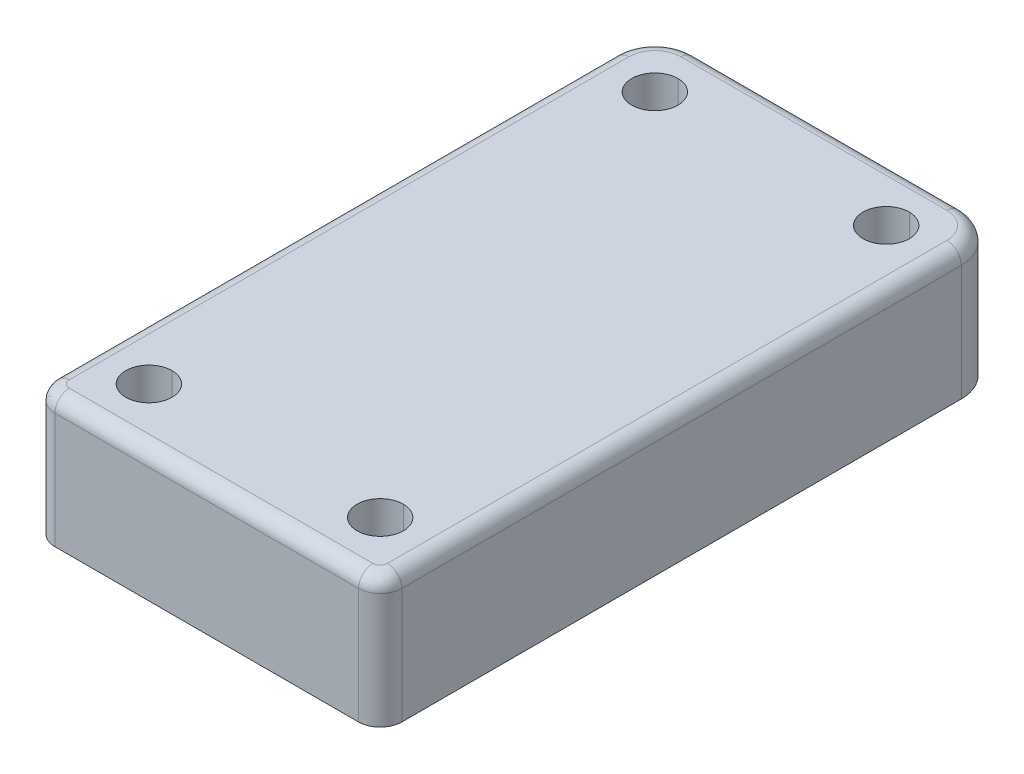
ISO-10303-21;
HEADER;
FILE_DESCRIPTION(('STEP AP214'),'2;1');
FILE_NAME('part.step','',(''),(''),'','','');
FILE_SCHEMA(('AUTOMOTIVE_DESIGN { 1 0 10303 214 1 1 1 1 }'));
ENDSEC;
DATA;
#1=APPLICATION_CONTEXT('core data for automotive mechanical design processes');
#2=APPLICATION_PROTOCOL_DEFINITION('international standard','automotive_design',2000,#1);
#3=PRODUCT_CONTEXT('',#1,'mechanical');
#4=PRODUCT('Part','Part','',(#3));
#5=PRODUCT_RELATED_PRODUCT_CATEGORY('part','',(#4));
#6=PRODUCT_DEFINITION_FORMATION('','',#4);
#7=PRODUCT_DEFINITION_CONTEXT('part definition',#1,'design');
#8=PRODUCT_DEFINITION('design','',#6,#7);
#9=PRODUCT_DEFINITION_SHAPE('','',#8);
#10=(LENGTH_UNIT() NAMED_UNIT(*) SI_UNIT(.MILLI.,.METRE.));
#11=(NAMED_UNIT(*) PLANE_ANGLE_UNIT() SI_UNIT($,.RADIAN.));
#12=(NAMED_UNIT(*) SI_UNIT($,.STERADIAN.) SOLID_ANGLE_UNIT());
#13=UNCERTAINTY_MEASURE_WITH_UNIT(LENGTH_MEASURE(1.E-05),#10,'distance_accuracy_value','');
#14=(GEOMETRIC_REPRESENTATION_CONTEXT(3) GLOBAL_UNCERTAINTY_ASSIGNED_CONTEXT((#13)) GLOBAL_UNIT_ASSIGNED_CONTEXT((#10,
#11,#12)) REPRESENTATION_CONTEXT('',''));
#15=CARTESIAN_POINT('',(0.,0.,0.));
#16=DIRECTION('',(0.,0.,1.));
#17=DIRECTION('',(1.,0.,0.));
#18=AXIS2_PLACEMENT_3D('',#15,#16,#17);
#19=CARTESIAN_POINT('',(-8.,0.,-39.));
#20=DIRECTION('',(0.,-1.,0.));
#21=DIRECTION('',(0.,0.,-1.));
#22=AXIS2_PLACEMENT_3D('',#19,#20,#21);
#23=CYLINDRICAL_SURFACE('',#22,1.6);
#24=DIRECTION('',(0.,1.,0.));
#25=VECTOR('',#24,1.);
#26=CARTESIAN_POINT('',(-8.,38.,-40.6));
#27=LINE('',#26,#25);
#28=CARTESIAN_POINT('',(-8.,38.,-40.6));
#29=VERTEX_POINT('',#28);
#30=CARTESIAN_POINT('',(-8.,47.,-40.6));
#31=VERTEX_POINT('',#30);
#32=EDGE_CURVE('E11',#29,#31,#27,.T.);
#33=ORIENTED_EDGE('',*,*,#32,.T.);
#34=CARTESIAN_POINT('',(-8.,47.,-39.));
#35=DIRECTION('',(0.,-1.,0.));
#36=DIRECTION('',(0.,0.,1.));
#37=AXIS2_PLACEMENT_3D('',#34,#35,#36);
#38=CIRCLE('',#37,1.6);
#39=CARTESIAN_POINT('',(-8.,47.,-37.4));
#40=VERTEX_POINT('',#39);
#41=EDGE_CURVE('E344',#40,#31,#38,.T.);
#42=ORIENTED_EDGE('',*,*,#41,.F.);
#43=DIRECTION('',(0.,1.,0.));
#44=VECTOR('',#43,1.);
#45=CARTESIAN_POINT('',(-8.,38.,-37.4));
#46=LINE('',#45,#44);
#47=CARTESIAN_POINT('',(-8.,38.,-37.4));
#48=VERTEX_POINT('',#47);
#49=EDGE_CURVE('E26',#48,#40,#46,.T.);
#50=ORIENTED_EDGE('',*,*,#49,.F.);
#51=CARTESIAN_POINT('',(-8.,38.,-39.));
#52=DIRECTION('',(0.,-1.,0.));
#53=DIRECTION('',(0.,0.,1.));
#54=AXIS2_PLACEMENT_3D('',#51,#52,#53);
#55=CIRCLE('',#54,1.6);
#56=EDGE_CURVE('E222',#48,#29,#55,.T.);
#57=ORIENTED_EDGE('',*,*,#56,.T.);
#58=EDGE_LOOP('',(#33,#42,#50,#57));
#59=FACE_BOUND('',#58,.T.);
#60=ADVANCED_FACE('F16',(#59),#23,.F.);
#61=CARTESIAN_POINT('',(-8.,0.,-39.));
#62=DIRECTION('',(0.,-1.,0.));
#63=DIRECTION('',(0.,0.,-1.));
#64=AXIS2_PLACEMENT_3D('',#61,#62,#63);
#65=CYLINDRICAL_SURFACE('',#64,1.6);
#66=ORIENTED_EDGE('',*,*,#49,.T.);
#67=CARTESIAN_POINT('',(-8.,47.,-39.));
#68=DIRECTION('',(0.,-1.,0.));
#69=DIRECTION('',(0.,0.,-1.));
#70=AXIS2_PLACEMENT_3D('',#67,#68,#69);
#71=CIRCLE('',#70,1.6);
#72=EDGE_CURVE('E337',#31,#40,#71,.T.);
#73=ORIENTED_EDGE('',*,*,#72,.F.);
#74=ORIENTED_EDGE('',*,*,#32,.F.);
#75=CARTESIAN_POINT('',(-8.,38.,-39.));
#76=DIRECTION('',(0.,-1.,0.));
#77=DIRECTION('',(0.,0.,-1.));
#78=AXIS2_PLACEMENT_3D('',#75,#76,#77);
#79=CIRCLE('',#78,1.6);
#80=EDGE_CURVE('E284',#29,#48,#79,.T.);
#81=ORIENTED_EDGE('',*,*,#80,.T.);
#82=EDGE_LOOP('',(#66,#73,#74,#81));
#83=FACE_BOUND('',#82,.T.);
#84=ADVANCED_FACE('F595',(#83),#65,.F.);
#85=CARTESIAN_POINT('',(-8.,0.,-4.));
#86=DIRECTION('',(0.,-1.,0.));
#87=DIRECTION('',(0.,0.,-1.));
#88=AXIS2_PLACEMENT_3D('',#85,#86,#87);
#89=CYLINDRICAL_SURFACE('',#88,1.6);
#90=DIRECTION('',(0.,1.,0.));
#91=VECTOR('',#90,1.);
#92=CARTESIAN_POINT('',(-8.,38.,-5.6));
#93=LINE('',#92,#91);
#94=CARTESIAN_POINT('',(-8.,38.,-5.6));
#95=VERTEX_POINT('',#94);
#96=CARTESIAN_POINT('',(-8.,47.,-5.6));
#97=VERTEX_POINT('',#96);
#98=EDGE_CURVE('E203',#95,#97,#93,.T.);
#99=ORIENTED_EDGE('',*,*,#98,.T.);
#100=CARTESIAN_POINT('',(-8.,47.,-4.));
#101=DIRECTION('',(0.,-1.,0.));
#102=DIRECTION('',(0.,0.,1.));
#103=AXIS2_PLACEMENT_3D('',#100,#101,#102);
#104=CIRCLE('',#103,1.6);
#105=CARTESIAN_POINT('',(-8.,47.,-2.4));
#106=VERTEX_POINT('',#105);
#107=EDGE_CURVE('E345',#106,#97,#104,.T.);
#108=ORIENTED_EDGE('',*,*,#107,.F.);
#109=DIRECTION('',(0.,1.,0.));
#110=VECTOR('',#109,1.);
#111=CARTESIAN_POINT('',(-8.,38.,-2.4));
#112=LINE('',#111,#110);
#113=CARTESIAN_POINT('',(-8.,38.,-2.4));
#114=VERTEX_POINT('',#113);
#115=EDGE_CURVE('E215',#114,#106,#112,.T.);
#116=ORIENTED_EDGE('',*,*,#115,.F.);
#117=CARTESIAN_POINT('',(-8.,38.,-4.));
#118=DIRECTION('',(0.,-1.,0.));
#119=DIRECTION('',(0.,0.,1.));
#120=AXIS2_PLACEMENT_3D('',#117,#118,#119);
#121=CIRCLE('',#120,1.6);
#122=EDGE_CURVE('E220',#114,#95,#121,.T.);
#123=ORIENTED_EDGE('',*,*,#122,.T.);
#124=EDGE_LOOP('',(#99,#108,#116,#123));
#125=FACE_BOUND('',#124,.T.);
#126=ADVANCED_FACE('F224',(#125),#89,.F.);
#127=CARTESIAN_POINT('',(-8.,0.,-4.));
#128=DIRECTION('',(0.,-1.,0.));
#129=DIRECTION('',(0.,0.,-1.));
#130=AXIS2_PLACEMENT_3D('',#127,#128,#129);
#131=CYLINDRICAL_SURFACE('',#130,1.6);
#132=ORIENTED_EDGE('',*,*,#115,.T.);
#133=CARTESIAN_POINT('',(-8.,47.,-4.));
#134=DIRECTION('',(0.,-1.,0.));
#135=DIRECTION('',(0.,0.,-1.));
#136=AXIS2_PLACEMENT_3D('',#133,#134,#135);
#137=CIRCLE('',#136,1.6);
#138=EDGE_CURVE('E209',#97,#106,#137,.T.);
#139=ORIENTED_EDGE('',*,*,#138,.F.);
#140=ORIENTED_EDGE('',*,*,#98,.F.);
#141=CARTESIAN_POINT('',(-8.,38.,-4.));
#142=DIRECTION('',(0.,-1.,0.));
#143=DIRECTION('',(0.,0.,-1.));
#144=AXIS2_PLACEMENT_3D('',#141,#142,#143);
#145=CIRCLE('',#144,1.6);
#146=EDGE_CURVE('E206',#95,#114,#145,.T.);
#147=ORIENTED_EDGE('',*,*,#146,.T.);
#148=EDGE_LOOP('',(#132,#139,#140,#147));
#149=FACE_BOUND('',#148,.T.);
#150=ADVANCED_FACE('F205',(#149),#131,.F.);
#151=CARTESIAN_POINT('',(8.,0.,-4.));
#152=DIRECTION('',(0.,-1.,0.));
#153=DIRECTION('',(0.,0.,-1.));
#154=AXIS2_PLACEMENT_3D('',#151,#152,#153);
#155=CYLINDRICAL_SURFACE('',#154,1.6);
#156=DIRECTION('',(0.,1.,0.));
#157=VECTOR('',#156,1.);
#158=CARTESIAN_POINT('',(8.,38.,-5.6));
#159=LINE('',#158,#157);
#160=CARTESIAN_POINT('',(8.,38.,-5.6));
#161=VERTEX_POINT('',#160);
#162=CARTESIAN_POINT('',(8.,47.,-5.6));
#163=VERTEX_POINT('',#162);
#164=EDGE_CURVE('E276',#161,#163,#159,.T.);
#165=ORIENTED_EDGE('',*,*,#164,.T.);
#166=CARTESIAN_POINT('',(8.,47.,-4.));
#167=DIRECTION('',(0.,-1.,0.));
#168=DIRECTION('',(0.,0.,1.));
#169=AXIS2_PLACEMENT_3D('',#166,#167,#168);
#170=CIRCLE('',#169,1.6);
#171=CARTESIAN_POINT('',(8.,47.,-2.4));
#172=VERTEX_POINT('',#171);
#173=EDGE_CURVE('E417',#172,#163,#170,.T.);
#174=ORIENTED_EDGE('',*,*,#173,.F.);
#175=DIRECTION('',(0.,1.,0.));
#176=VECTOR('',#175,1.);
#177=CARTESIAN_POINT('',(8.,38.,-2.4));
#178=LINE('',#177,#176);
#179=CARTESIAN_POINT('',(8.,38.,-2.4));
#180=VERTEX_POINT('',#179);
#181=EDGE_CURVE('E381',#180,#172,#178,.T.);
#182=ORIENTED_EDGE('',*,*,#181,.F.);
#183=CARTESIAN_POINT('',(8.,38.,-4.));
#184=DIRECTION('',(0.,-1.,0.));
#185=DIRECTION('',(0.,0.,1.));
#186=AXIS2_PLACEMENT_3D('',#183,#184,#185);
#187=CIRCLE('',#186,1.6);
#188=EDGE_CURVE('E233',#180,#161,#187,.T.);
#189=ORIENTED_EDGE('',*,*,#188,.T.);
#190=EDGE_LOOP('',(#165,#174,#182,#189));
#191=FACE_BOUND('',#190,.T.);
#192=ADVANCED_FACE('F512',(#191),#155,.F.);
#193=CARTESIAN_POINT('',(8.,0.,-4.));
#194=DIRECTION('',(0.,-1.,0.));
#195=DIRECTION('',(0.,0.,-1.));
#196=AXIS2_PLACEMENT_3D('',#193,#194,#195);
#197=CYLINDRICAL_SURFACE('',#196,1.6);
#198=ORIENTED_EDGE('',*,*,#181,.T.);
#199=CARTESIAN_POINT('',(8.,47.,-4.));
#200=DIRECTION('',(0.,-1.,0.));
#201=DIRECTION('',(0.,0.,-1.));
#202=AXIS2_PLACEMENT_3D('',#199,#200,#201);
#203=CIRCLE('',#202,1.6);
#204=EDGE_CURVE('E414',#163,#172,#203,.T.);
#205=ORIENTED_EDGE('',*,*,#204,.F.);
#206=ORIENTED_EDGE('',*,*,#164,.F.);
#207=CARTESIAN_POINT('',(8.,38.,-4.));
#208=DIRECTION('',(0.,-1.,0.));
#209=DIRECTION('',(0.,0.,-1.));
#210=AXIS2_PLACEMENT_3D('',#207,#208,#209);
#211=CIRCLE('',#210,1.6);
#212=EDGE_CURVE('E226',#161,#180,#211,.T.);
#213=ORIENTED_EDGE('',*,*,#212,.T.);
#214=EDGE_LOOP('',(#198,#205,#206,#213));
#215=FACE_BOUND('',#214,.T.);
#216=ADVANCED_FACE('F477',(#215),#197,.F.);
#217=CARTESIAN_POINT('',(8.,0.,-39.));
#218=DIRECTION('',(0.,-1.,0.));
#219=DIRECTION('',(0.,0.,-1.));
#220=AXIS2_PLACEMENT_3D('',#217,#218,#219);
#221=CYLINDRICAL_SURFACE('',#220,1.6);
#222=DIRECTION('',(0.,1.,0.));
#223=VECTOR('',#222,1.);
#224=CARTESIAN_POINT('',(8.,38.,-40.6));
#225=LINE('',#224,#223);
#226=CARTESIAN_POINT('',(8.,38.,-40.6));
#227=VERTEX_POINT('',#226);
#228=CARTESIAN_POINT('',(8.,47.,-40.6));
#229=VERTEX_POINT('',#228);
#230=EDGE_CURVE('E322',#227,#229,#225,.T.);
#231=ORIENTED_EDGE('',*,*,#230,.T.);
#232=CARTESIAN_POINT('',(8.,47.,-39.));
#233=DIRECTION('',(0.,-1.,0.));
#234=DIRECTION('',(0.,0.,1.));
#235=AXIS2_PLACEMENT_3D('',#232,#233,#234);
#236=CIRCLE('',#235,1.6);
#237=CARTESIAN_POINT('',(8.,47.,-37.4));
#238=VERTEX_POINT('',#237);
#239=EDGE_CURVE('E263',#238,#229,#236,.T.);
#240=ORIENTED_EDGE('',*,*,#239,.F.);
#241=DIRECTION('',(0.,1.,0.));
#242=VECTOR('',#241,1.);
#243=CARTESIAN_POINT('',(8.,38.,-37.4));
#244=LINE('',#243,#242);
#245=CARTESIAN_POINT('',(8.,38.,-37.4));
#246=VERTEX_POINT('',#245);
#247=EDGE_CURVE('E272',#246,#238,#244,.T.);
#248=ORIENTED_EDGE('',*,*,#247,.F.);
#249=CARTESIAN_POINT('',(8.,38.,-39.));
#250=DIRECTION('',(0.,-1.,0.));
#251=DIRECTION('',(0.,0.,1.));
#252=AXIS2_PLACEMENT_3D('',#249,#250,#251);
#253=CIRCLE('',#252,1.6);
#254=EDGE_CURVE('E360',#246,#227,#253,.T.);
#255=ORIENTED_EDGE('',*,*,#254,.T.);
#256=EDGE_LOOP('',(#231,#240,#248,#255));
#257=FACE_BOUND('',#256,.T.);
#258=ADVANCED_FACE('F471',(#257),#221,.F.);
#259=CARTESIAN_POINT('',(8.,0.,-39.));
#260=DIRECTION('',(0.,-1.,0.));
#261=DIRECTION('',(0.,0.,-1.));
#262=AXIS2_PLACEMENT_3D('',#259,#260,#261);
#263=CYLINDRICAL_SURFACE('',#262,1.6);
#264=ORIENTED_EDGE('',*,*,#247,.T.);
#265=CARTESIAN_POINT('',(8.,47.,-39.));
#266=DIRECTION('',(0.,-1.,0.));
#267=DIRECTION('',(0.,0.,-1.));
#268=AXIS2_PLACEMENT_3D('',#265,#266,#267);
#269=CIRCLE('',#268,1.6);
#270=EDGE_CURVE('E267',#229,#238,#269,.T.);
#271=ORIENTED_EDGE('',*,*,#270,.F.);
#272=ORIENTED_EDGE('',*,*,#230,.F.);
#273=CARTESIAN_POINT('',(8.,38.,-39.));
#274=DIRECTION('',(0.,-1.,0.));
#275=DIRECTION('',(0.,0.,-1.));
#276=AXIS2_PLACEMENT_3D('',#273,#274,#275);
#277=CIRCLE('',#276,1.6);
#278=EDGE_CURVE('E366',#227,#246,#277,.T.);
#279=ORIENTED_EDGE('',*,*,#278,.T.);
#280=EDGE_LOOP('',(#264,#271,#272,#279));
#281=FACE_BOUND('',#280,.T.);
#282=ADVANCED_FACE('F476',(#281),#263,.F.);
#283=CARTESIAN_POINT('',(11.,46.,-1.401923098471));
#284=DIRECTION('',(0.,0.,-1.));
#285=DIRECTION('',(0.,1.,0.));
#286=AXIS2_PLACEMENT_3D('',#283,#284,#285);
#287=CYLINDRICAL_SURFACE('',#286,1.);
#288=CARTESIAN_POINT('',(11.,46.,-1.5));
#289=DIRECTION('',(0.,0.,-1.));
#290=DIRECTION('',(0.,1.,0.));
#291=AXIS2_PLACEMENT_3D('',#288,#289,#290);
#292=CIRCLE('',#291,1.);
#293=CARTESIAN_POINT('',(10.99999947275,47.,-1.5));
#294=VERTEX_POINT('',#293);
#295=CARTESIAN_POINT('',(12.,46.,-1.5));
#296=VERTEX_POINT('',#295);
#297=EDGE_CURVE('E258',#294,#296,#292,.T.);
#298=ORIENTED_EDGE('',*,*,#297,.T.);
#299=DIRECTION('',(0.,0.,-1.));
#300=VECTOR('',#299,1.);
#301=CARTESIAN_POINT('',(12.,46.,-1.500000000906));
#302=LINE('',#301,#300);
#303=CARTESIAN_POINT('',(12.,46.,-40.2));
#304=VERTEX_POINT('',#303);
#305=EDGE_CURVE('E269',#296,#304,#302,.T.);
#306=ORIENTED_EDGE('',*,*,#305,.T.);
#307=CARTESIAN_POINT('',(11.,46.,-40.20000000798));
#308=DIRECTION('',(-4.433033176654E-09,0.,-1.));
#309=DIRECTION('',(0.,1.,0.));
#310=AXIS2_PLACEMENT_3D('',#307,#308,#309);
#311=CIRCLE('',#310,1.);
#312=CARTESIAN_POINT('',(10.99999969856,47.,-40.2));
#313=VERTEX_POINT('',#312);
#314=EDGE_CURVE('E334',#313,#304,#311,.T.);
#315=ORIENTED_EDGE('',*,*,#314,.F.);
#316=DIRECTION('',(0.,0.,-1.));
#317=VECTOR('',#316,1.);
#318=CARTESIAN_POINT('',(11.,47.,-1.5));
#319=LINE('',#318,#317);
#320=EDGE_CURVE('E165',#294,#313,#319,.T.);
#321=ORIENTED_EDGE('',*,*,#320,.F.);
#322=EDGE_LOOP('',(#298,#306,#315,#321));
#323=FACE_BOUND('',#322,.T.);
#324=ADVANCED_FACE('F519',(#323),#287,.T.);
#325=CARTESIAN_POINT('',(12.,38.,0.));
#326=DIRECTION('',(1.,0.,0.));
#327=DIRECTION('',(0.,1.,0.));
#328=AXIS2_PLACEMENT_3D('',#325,#326,#327);
#329=PLANE('',#328);
#330=DIRECTION('',(0.,-1.,1.132488547384E-10));
#331=VECTOR('',#330,1.);
#332=CARTESIAN_POINT('',(12.,46.,-1.500000000906));
#333=LINE('',#332,#331);
#334=CARTESIAN_POINT('',(12.,38.,-1.5));
#335=VERTEX_POINT('',#334);
#336=EDGE_CURVE('E285',#296,#335,#333,.T.);
#337=ORIENTED_EDGE('',*,*,#336,.T.);
#338=DIRECTION('',(0.,0.,-1.));
#339=VECTOR('',#338,1.);
#340=CARTESIAN_POINT('',(12.,38.,-1.5));
#341=LINE('',#340,#339);
#342=CARTESIAN_POINT('',(12.,38.,-40.2));
#343=VERTEX_POINT('',#342);
#344=EDGE_CURVE('E361',#335,#343,#341,.T.);
#345=ORIENTED_EDGE('',*,*,#344,.T.);
#346=DIRECTION('',(0.,-1.,-1.342730371334E-10));
#347=VECTOR('',#346,1.);
#348=CARTESIAN_POINT('',(12.,46.,-40.19999999893));
#349=LINE('',#348,#347);
#350=EDGE_CURVE('E273',#304,#343,#349,.T.);
#351=ORIENTED_EDGE('',*,*,#350,.F.);
#352=ORIENTED_EDGE('',*,*,#305,.F.);
#353=EDGE_LOOP('',(#337,#345,#351,#352));
#354=FACE_BOUND('',#353,.T.);
#355=ADVANCED_FACE('F524',(#354),#329,.T.);
#356=CARTESIAN_POINT('',(9.2,47.09980667988,-40.2));
#357=DIRECTION('',(0.,-1.,0.));
#358=DIRECTION('',(0.,0.,-1.));
#359=AXIS2_PLACEMENT_3D('',#356,#357,#358);
#360=CYLINDRICAL_SURFACE('',#359,2.8);
#361=ORIENTED_EDGE('',*,*,#350,.T.);
#362=CARTESIAN_POINT('',(9.2,38.,-40.2));
#363=DIRECTION('',(0.,-1.,0.));
#364=DIRECTION('',(0.,0.,-1.));
#365=AXIS2_PLACEMENT_3D('',#362,#363,#364);
#366=CIRCLE('',#365,2.8);
#367=CARTESIAN_POINT('',(9.2,38.,-43.));
#368=VERTEX_POINT('',#367);
#369=EDGE_CURVE('E365',#368,#343,#366,.T.);
#370=ORIENTED_EDGE('',*,*,#369,.F.);
#371=DIRECTION('',(4.174727230577E-11,-1.,0.));
#372=VECTOR('',#371,1.);
#373=CARTESIAN_POINT('',(9.199999999666,46.,-43.));
#374=LINE('',#373,#372);
#375=CARTESIAN_POINT('',(9.2,46.,-43.));
#376=VERTEX_POINT('',#375);
#377=EDGE_CURVE('E237',#376,#368,#374,.T.);
#378=ORIENTED_EDGE('',*,*,#377,.F.);
#379=CARTESIAN_POINT('',(9.2,46.,-40.2));
#380=DIRECTION('',(0.,1.,0.));
#381=DIRECTION('',(1.,0.,0.));
#382=AXIS2_PLACEMENT_3D('',#379,#380,#381);
#383=CIRCLE('',#382,2.8);
#384=EDGE_CURVE('E249',#304,#376,#383,.T.);
#385=ORIENTED_EDGE('',*,*,#384,.F.);
#386=EDGE_LOOP('',(#361,#370,#378,#385));
#387=FACE_BOUND('',#386,.T.);
#388=ADVANCED_FACE('F552',(#387),#360,.T.);
#389=CARTESIAN_POINT('',(12.,38.,-43.));
#390=DIRECTION('',(0.,0.,-1.));
#391=DIRECTION('',(0.,-1.,0.));
#392=AXIS2_PLACEMENT_3D('',#389,#390,#391);
#393=PLANE('',#392);
#394=ORIENTED_EDGE('',*,*,#377,.T.);
#395=DIRECTION('',(-1.,0.,0.));
#396=VECTOR('',#395,1.);
#397=CARTESIAN_POINT('',(9.2,38.,-43.));
#398=LINE('',#397,#396);
#399=CARTESIAN_POINT('',(-9.2,38.,-43.));
#400=VERTEX_POINT('',#399);
#401=EDGE_CURVE('E242',#368,#400,#398,.T.);
#402=ORIENTED_EDGE('',*,*,#401,.T.);
#403=DIRECTION('',(-1.342737032672E-10,-1.,0.));
#404=VECTOR('',#403,1.);
#405=CARTESIAN_POINT('',(-9.199999998926,46.,-43.));
#406=LINE('',#405,#404);
#407=CARTESIAN_POINT('',(-9.199999998926,46.,-43.));
#408=VERTEX_POINT('',#407);
#409=EDGE_CURVE('E315',#408,#400,#406,.T.);
#410=ORIENTED_EDGE('',*,*,#409,.F.);
#411=DIRECTION('',(-1.,0.,0.));
#412=VECTOR('',#411,1.);
#413=CARTESIAN_POINT('',(9.199999999666,46.,-43.));
#414=LINE('',#413,#412);
#415=EDGE_CURVE('E248',#376,#408,#414,.T.);
#416=ORIENTED_EDGE('',*,*,#415,.F.);
#417=EDGE_LOOP('',(#394,#402,#410,#416));
#418=FACE_BOUND('',#417,.T.);
#419=ADVANCED_FACE('F453',(#418),#393,.T.);
#420=CARTESIAN_POINT('',(-9.2,47.09980667988,-40.2));
#421=DIRECTION('',(0.,-1.,0.));
#422=DIRECTION('',(-1.,0.,0.));
#423=AXIS2_PLACEMENT_3D('',#420,#421,#422);
#424=CYLINDRICAL_SURFACE('',#423,2.8);
#425=ORIENTED_EDGE('',*,*,#409,.T.);
#426=CARTESIAN_POINT('',(-9.2,38.,-40.2));
#427=DIRECTION('',(0.,-1.,0.));
#428=DIRECTION('',(-1.,0.,0.));
#429=AXIS2_PLACEMENT_3D('',#426,#427,#428);
#430=CIRCLE('',#429,2.8);
#431=CARTESIAN_POINT('',(-12.,38.,-40.2));
#432=VERTEX_POINT('',#431);
#433=EDGE_CURVE('E239',#432,#400,#430,.T.);
#434=ORIENTED_EDGE('',*,*,#433,.F.);
#435=DIRECTION('',(0.,-1.,-4.174616208275E-11));
#436=VECTOR('',#435,1.);
#437=CARTESIAN_POINT('',(-12.,46.,-40.19999999967));
#438=LINE('',#437,#436);
#439=CARTESIAN_POINT('',(-12.,46.,-40.2));
#440=VERTEX_POINT('',#439);
#441=EDGE_CURVE('E317',#440,#432,#438,.T.);
#442=ORIENTED_EDGE('',*,*,#441,.F.);
#443=CARTESIAN_POINT('',(-9.2,46.,-40.2));
#444=DIRECTION('',(0.,1.,0.));
#445=DIRECTION('',(0.,0.,-1.));
#446=AXIS2_PLACEMENT_3D('',#443,#444,#445);
#447=CIRCLE('',#446,2.8);
#448=EDGE_CURVE('E401',#408,#440,#447,.T.);
#449=ORIENTED_EDGE('',*,*,#448,.F.);
#450=EDGE_LOOP('',(#425,#434,#442,#449));
#451=FACE_BOUND('',#450,.T.);
#452=ADVANCED_FACE('F458',(#451),#424,.T.);
#453=CARTESIAN_POINT('',(-12.,38.,-43.));
#454=DIRECTION('',(-1.,0.,0.));
#455=DIRECTION('',(0.,0.,1.));
#456=AXIS2_PLACEMENT_3D('',#453,#454,#455);
#457=PLANE('',#456);
#458=ORIENTED_EDGE('',*,*,#441,.T.);
#459=DIRECTION('',(0.,0.,1.));
#460=VECTOR('',#459,1.);
#461=CARTESIAN_POINT('',(-12.,38.,-40.2));
#462=LINE('',#461,#460);
#463=CARTESIAN_POINT('',(-12.,38.,-1.5));
#464=VERTEX_POINT('',#463);
#465=EDGE_CURVE('E243',#432,#464,#462,.T.);
#466=ORIENTED_EDGE('',*,*,#465,.T.);
#467=DIRECTION('',(0.,-1.,2.332551374273E-10));
#468=VECTOR('',#467,1.);
#469=CARTESIAN_POINT('',(-12.,46.,-1.500000001866));
#470=LINE('',#469,#468);
#471=CARTESIAN_POINT('',(-12.,46.,-1.500000001866));
#472=VERTEX_POINT('',#471);
#473=EDGE_CURVE('E377',#472,#464,#470,.T.);
#474=ORIENTED_EDGE('',*,*,#473,.F.);
#475=DIRECTION('',(0.,0.,1.));
#476=VECTOR('',#475,1.);
#477=CARTESIAN_POINT('',(-12.,46.,-40.19999999967));
#478=LINE('',#477,#476);
#479=EDGE_CURVE('E346',#440,#472,#478,.T.);
#480=ORIENTED_EDGE('',*,*,#479,.F.);
#481=EDGE_LOOP('',(#458,#466,#474,#480));
#482=FACE_BOUND('',#481,.T.);
#483=ADVANCED_FACE('F463',(#482),#457,.T.);
#484=CARTESIAN_POINT('',(-10.5,47.09980667988,-1.5));
#485=DIRECTION('',(0.,-1.,0.));
#486=DIRECTION('',(0.,0.,1.));
#487=AXIS2_PLACEMENT_3D('',#484,#485,#486);
#488=CYLINDRICAL_SURFACE('',#487,1.5);
#489=ORIENTED_EDGE('',*,*,#473,.T.);
#490=CARTESIAN_POINT('',(-10.5,38.,-1.5));
#491=DIRECTION('',(0.,-1.,0.));
#492=DIRECTION('',(0.,0.,1.));
#493=AXIS2_PLACEMENT_3D('',#490,#491,#492);
#494=CIRCLE('',#493,1.5);
#495=CARTESIAN_POINT('',(-10.5,38.,0.));
#496=VERTEX_POINT('',#495);
#497=EDGE_CURVE('E253',#496,#464,#494,.T.);
#498=ORIENTED_EDGE('',*,*,#497,.F.);
#499=DIRECTION('',(-1.132487437161E-10,-1.,0.));
#500=VECTOR('',#499,1.);
#501=CARTESIAN_POINT('',(-10.49999999909,46.,0.));
#502=LINE('',#501,#500);
#503=CARTESIAN_POINT('',(-10.5,46.,0.));
#504=VERTEX_POINT('',#503);
#505=EDGE_CURVE('E40',#504,#496,#502,.T.);
#506=ORIENTED_EDGE('',*,*,#505,.F.);
#507=CARTESIAN_POINT('',(-10.5,46.,-1.5));
#508=DIRECTION('',(0.,1.,0.));
#509=DIRECTION('',(-1.,0.,0.));
#510=AXIS2_PLACEMENT_3D('',#507,#508,#509);
#511=CIRCLE('',#510,1.5);
#512=EDGE_CURVE('E431',#472,#504,#511,.T.);
#513=ORIENTED_EDGE('',*,*,#512,.F.);
#514=EDGE_LOOP('',(#489,#498,#506,#513));
#515=FACE_BOUND('',#514,.T.);
#516=ADVANCED_FACE('F534',(#515),#488,.T.);
#517=CARTESIAN_POINT('',(-12.,38.,0.));
#518=DIRECTION('',(0.,0.,1.));
#519=DIRECTION('',(1.,0.,0.));
#520=AXIS2_PLACEMENT_3D('',#517,#518,#519);
#521=PLANE('',#520);
#522=ORIENTED_EDGE('',*,*,#505,.T.);
#523=DIRECTION('',(1.,0.,0.));
#524=VECTOR('',#523,1.);
#525=CARTESIAN_POINT('',(-10.5,38.,0.));
#526=LINE('',#525,#524);
#527=CARTESIAN_POINT('',(10.5,38.,0.));
#528=VERTEX_POINT('',#527);
#529=EDGE_CURVE('E330',#496,#528,#526,.T.);
#530=ORIENTED_EDGE('',*,*,#529,.T.);
#531=DIRECTION('',(2.332551929385E-10,-1.,0.));
#532=VECTOR('',#531,1.);
#533=CARTESIAN_POINT('',(10.49999999813,46.,0.));
#534=LINE('',#533,#532);
#535=CARTESIAN_POINT('',(10.49999999813,46.,0.));
#536=VERTEX_POINT('',#535);
#537=EDGE_CURVE('E288',#536,#528,#534,.T.);
#538=ORIENTED_EDGE('',*,*,#537,.F.);
#539=DIRECTION('',(1.,0.,0.));
#540=VECTOR('',#539,1.);
#541=CARTESIAN_POINT('',(-10.49999999909,46.,0.));
#542=LINE('',#541,#540);
#543=EDGE_CURVE('E259',#504,#536,#542,.T.);
#544=ORIENTED_EDGE('',*,*,#543,.F.);
#545=EDGE_LOOP('',(#522,#530,#538,#544));
#546=FACE_BOUND('',#545,.T.);
#547=ADVANCED_FACE('F491',(#546),#521,.T.);
#548=CARTESIAN_POINT('',(-10.59807690153,46.,-1.));
#549=DIRECTION('',(1.,0.,0.));
#550=DIRECTION('',(0.,1.,0.));
#551=AXIS2_PLACEMENT_3D('',#548,#549,#550);
#552=CYLINDRICAL_SURFACE('',#551,1.);
#553=CARTESIAN_POINT('',(-10.5,46.,-1.));
#554=DIRECTION('',(1.,0.,0.));
#555=DIRECTION('',(0.,1.,0.));
#556=AXIS2_PLACEMENT_3D('',#553,#554,#555);
#557=CIRCLE('',#556,1.);
#558=CARTESIAN_POINT('',(-10.5,47.,-1.000000527252));
#559=VERTEX_POINT('',#558);
#560=EDGE_CURVE('E262',#559,#504,#557,.T.);
#561=ORIENTED_EDGE('',*,*,#560,.T.);
#562=ORIENTED_EDGE('',*,*,#543,.T.);
#563=CARTESIAN_POINT('',(10.49999999874,46.,-1.));
#564=DIRECTION('',(1.,0.,2.521266598277E-09));
#565=DIRECTION('',(0.,1.,0.));
#566=AXIS2_PLACEMENT_3D('',#563,#564,#565);
#567=CIRCLE('',#566,1.);
#568=CARTESIAN_POINT('',(10.5,47.,-1.));
#569=VERTEX_POINT('',#568);
#570=EDGE_CURVE('E297',#569,#536,#567,.T.);
#571=ORIENTED_EDGE('',*,*,#570,.F.);
#572=DIRECTION('',(1.,0.,0.));
#573=VECTOR('',#572,1.);
#574=CARTESIAN_POINT('',(-10.5,47.,-1.));
#575=LINE('',#574,#573);
#576=EDGE_CURVE('E176',#559,#569,#575,.T.);
#577=ORIENTED_EDGE('',*,*,#576,.F.);
#578=EDGE_LOOP('',(#561,#562,#571,#577));
#579=FACE_BOUND('',#578,.T.);
#580=ADVANCED_FACE('F485',(#579),#552,.T.);
#581=CARTESIAN_POINT('',(-10.43541698153,46.9970718549,-1.081423377942));
#582=CARTESIAN_POINT('',(-10.33513971118,47.04750716056,-0.4315045279872));
#583=CARTESIAN_POINT('',(-10.26402462596,46.58114228866,0.02940784268421));
#584=CARTESIAN_POINT('',(-10.27171506774,45.92353279043,-0.02043558701051));
#585=CARTESIAN_POINT('',(-10.74490020915,46.9970718549,-1.033672595999));
#586=CARTESIAN_POINT('',(-11.1251537969,47.04750716056,-0.3096116854307));
#587=CARTESIAN_POINT('',(-11.39482374508,46.58114228866,0.203881084973));
#588=CARTESIAN_POINT('',(-11.36566142279,45.92353279043,0.1483515691063));
#589=CARTESIAN_POINT('',(-10.96632740409,46.9970718549,-1.255099791025));
#590=CARTESIAN_POINT('',(-11.69038831481,47.04750716056,-0.8748462035503));
#591=CARTESIAN_POINT('',(-12.20388108531,46.58114228866,-0.6051762555691));
#592=CARTESIAN_POINT('',(-12.14835156944,45.92353279043,-0.634338577841801));
#593=CARTESIAN_POINT('',(-10.91857662203,46.9970718549,-1.56458301863));
#594=CARTESIAN_POINT('',(-11.56849547195,47.04750716056,-1.664860289225));
#595=CARTESIAN_POINT('',(-12.02940784259,46.58114228866,-1.73597537462));
#596=CARTESIAN_POINT('',(-11.9795644129,45.92353279043,-1.728284932825));
#597=(BOUNDED_SURFACE() B_SPLINE_SURFACE(3,3,((#581,#582,#583,#584),(#585,#586,#587,#588),(#589,
#590,#591,#592),(#593,#594,#595,#596)),.UNSPECIFIED.,.F.,.F.,
.F.) B_SPLINE_SURFACE_WITH_KNOTS((4,4),(4,4),(0.,1.),(0.,1.),
.UNSPECIFIED.) GEOMETRIC_REPRESENTATION_ITEM() RATIONAL_B_SPLINE_SURFACE(((1.522820161006,
1.168474892713,1.168474892713,1.522820161006),(1.107610474766,0.8498804151731,0.8498804151731,
1.107610474766),(1.107610474766,0.8498804151731,0.8498804151731,1.107610474766),(1.522820161006,
1.168474892713,1.168474892713,1.522820161006))) REPRESENTATION_ITEM('') SURFACE());
#598=CARTESIAN_POINT('',(-11.,46.,-1.500000001261));
#599=DIRECTION('',(-2.521266057043E-09,0.,1.));
#600=DIRECTION('',(0.,1.,0.));
#601=AXIS2_PLACEMENT_3D('',#598,#599,#600);
#602=CIRCLE('',#601,1.);
#603=CARTESIAN_POINT('',(-11.,47.,-1.5));
#604=VERTEX_POINT('',#603);
#605=EDGE_CURVE('E313',#604,#472,#602,.T.);
#606=CARTESIAN_POINT('',(-10.5,47.,-1.5));
#607=DIRECTION('',(0.,1.,0.));
#608=DIRECTION('',(-1.,0.,0.));
#609=AXIS2_PLACEMENT_3D('',#606,#607,#608);
#610=CIRCLE('',#609,0.4999994727481);
#611=EDGE_CURVE('E339',#604,#559,#610,.T.);
#612=ORIENTED_EDGE('',*,*,#605,.T.);
#613=ORIENTED_EDGE('',*,*,#512,.T.);
#614=ORIENTED_EDGE('',*,*,#560,.F.);
#615=ORIENTED_EDGE('',*,*,#611,.F.);
#616=EDGE_LOOP('',(#612,#613,#614,#615));
#617=FACE_BOUND('',#616,.T.);
#618=ADVANCED_FACE('F490',(#617),#597,.T.);
#619=CARTESIAN_POINT('',(-11.,46.,-40.29807690153));
#620=DIRECTION('',(0.,0.,1.));
#621=DIRECTION('',(0.,1.,0.));
#622=AXIS2_PLACEMENT_3D('',#619,#620,#621);
#623=CYLINDRICAL_SURFACE('',#622,1.);
#624=CARTESIAN_POINT('',(-11.,46.,-40.2));
#625=DIRECTION('',(0.,0.,1.));
#626=DIRECTION('',(0.,1.,0.));
#627=AXIS2_PLACEMENT_3D('',#624,#625,#626);
#628=CIRCLE('',#627,1.);
#629=CARTESIAN_POINT('',(-10.99999969856,47.,-40.2));
#630=VERTEX_POINT('',#629);
#631=EDGE_CURVE('E19',#630,#440,#628,.T.);
#632=ORIENTED_EDGE('',*,*,#631,.T.);
#633=ORIENTED_EDGE('',*,*,#479,.T.);
#634=ORIENTED_EDGE('',*,*,#605,.F.);
#635=DIRECTION('',(0.,0.,1.));
#636=VECTOR('',#635,1.);
#637=CARTESIAN_POINT('',(-11.,47.,-40.2));
#638=LINE('',#637,#636);
#639=EDGE_CURVE('E281',#630,#604,#638,.T.);
#640=ORIENTED_EDGE('',*,*,#639,.F.);
#641=EDGE_LOOP('',(#632,#633,#634,#640));
#642=FACE_BOUND('',#641,.T.);
#643=ADVANCED_FACE('F466',(#642),#623,.T.);
#644=CARTESIAN_POINT('',(-9.2,46.,-40.2));
#645=DIRECTION('',(0.,-1.,0.));
#646=DIRECTION('',(0.0497379324745579,0.,-0.998762303089757));
#647=AXIS2_PLACEMENT_3D('',#644,#645,#646);
#648=TOROIDAL_SURFACE('',#647,1.8,1.);
#649=CARTESIAN_POINT('',(-9.200000007979,46.,-42.));
#650=DIRECTION('',(-1.,0.,4.43303314196E-09));
#651=DIRECTION('',(0.,1.,0.));
#652=AXIS2_PLACEMENT_3D('',#649,#650,#651);
#653=CIRCLE('',#652,1.);
#654=CARTESIAN_POINT('',(-9.2,47.,-42.));
#655=VERTEX_POINT('',#654);
#656=EDGE_CURVE('E326',#655,#408,#653,.T.);
#657=ORIENTED_EDGE('',*,*,#656,.T.);
#658=ORIENTED_EDGE('',*,*,#448,.T.);
#659=ORIENTED_EDGE('',*,*,#631,.F.);
#660=CARTESIAN_POINT('',(-9.2,47.,-40.2));
#661=DIRECTION('',(0.,1.,0.));
#662=DIRECTION('',(0.,0.,-1.));
#663=AXIS2_PLACEMENT_3D('',#660,#661,#662);
#664=CIRCLE('',#663,1.799999698559);
#665=EDGE_CURVE('E277',#655,#630,#664,.T.);
#666=ORIENTED_EDGE('',*,*,#665,.F.);
#667=EDGE_LOOP('',(#657,#658,#659,#666));
#668=FACE_BOUND('',#667,.T.);
#669=ADVANCED_FACE('F445',(#668),#648,.T.);
#670=CARTESIAN_POINT('',(9.298076901529,46.,-42.));
#671=DIRECTION('',(-1.,0.,0.));
#672=DIRECTION('',(0.,1.,0.));
#673=AXIS2_PLACEMENT_3D('',#670,#671,#672);
#674=CYLINDRICAL_SURFACE('',#673,1.);
#675=CARTESIAN_POINT('',(9.2,46.,-42.));
#676=DIRECTION('',(-1.,0.,0.));
#677=DIRECTION('',(0.,1.,0.));
#678=AXIS2_PLACEMENT_3D('',#675,#676,#677);
#679=CIRCLE('',#678,1.);
#680=CARTESIAN_POINT('',(9.2,47.,-41.99999969856));
#681=VERTEX_POINT('',#680);
#682=EDGE_CURVE('E244',#681,#376,#679,.T.);
#683=ORIENTED_EDGE('',*,*,#682,.T.);
#684=ORIENTED_EDGE('',*,*,#415,.T.);
#685=ORIENTED_EDGE('',*,*,#656,.F.);
#686=DIRECTION('',(-1.,0.,0.));
#687=VECTOR('',#686,1.);
#688=CARTESIAN_POINT('',(9.2,47.,-42.));
#689=LINE('',#688,#687);
#690=EDGE_CURVE('E257',#681,#655,#689,.T.);
#691=ORIENTED_EDGE('',*,*,#690,.F.);
#692=EDGE_LOOP('',(#683,#684,#685,#691));
#693=FACE_BOUND('',#692,.T.);
#694=ADVANCED_FACE('F451',(#693),#674,.T.);
#695=CARTESIAN_POINT('',(9.2,46.,-40.2));
#696=DIRECTION('',(0.,-1.,0.));
#697=DIRECTION('',(0.998762303089757,0.,0.0497379324745679));
#698=AXIS2_PLACEMENT_3D('',#695,#696,#697);
#699=TOROIDAL_SURFACE('',#698,1.8,1.);
#700=ORIENTED_EDGE('',*,*,#314,.T.);
#701=ORIENTED_EDGE('',*,*,#384,.T.);
#702=ORIENTED_EDGE('',*,*,#682,.F.);
#703=CARTESIAN_POINT('',(9.2,47.,-40.2));
#704=DIRECTION('',(0.,1.,0.));
#705=DIRECTION('',(1.,0.,0.));
#706=AXIS2_PLACEMENT_3D('',#703,#704,#705);
#707=CIRCLE('',#706,1.799999698559);
#708=EDGE_CURVE('E268',#313,#681,#707,.T.);
#709=ORIENTED_EDGE('',*,*,#708,.F.);
#710=EDGE_LOOP('',(#700,#701,#702,#709));
#711=FACE_BOUND('',#710,.T.);
#712=ADVANCED_FACE('F606',(#711),#699,.T.);
#713=CARTESIAN_POINT('',(0.,47.,0.));
#714=DIRECTION('',(0.,1.,0.));
#715=DIRECTION('',(1.,0.,0.));
#716=AXIS2_PLACEMENT_3D('',#713,#714,#715);
#717=PLANE('',#716);
#718=ORIENTED_EDGE('',*,*,#41,.T.);
#719=ORIENTED_EDGE('',*,*,#72,.T.);
#720=EDGE_LOOP('',(#718,#719));
#721=FACE_BOUND('',#720,.T.);
#722=ORIENTED_EDGE('',*,*,#107,.T.);
#723=ORIENTED_EDGE('',*,*,#138,.T.);
#724=EDGE_LOOP('',(#722,#723));
#725=FACE_BOUND('',#724,.T.);
#726=ORIENTED_EDGE('',*,*,#173,.T.);
#727=ORIENTED_EDGE('',*,*,#204,.T.);
#728=EDGE_LOOP('',(#726,#727));
#729=FACE_BOUND('',#728,.T.);
#730=ORIENTED_EDGE('',*,*,#239,.T.);
#731=ORIENTED_EDGE('',*,*,#270,.T.);
#732=EDGE_LOOP('',(#730,#731));
#733=FACE_BOUND('',#732,.T.);
#734=ORIENTED_EDGE('',*,*,#690,.T.);
#735=ORIENTED_EDGE('',*,*,#665,.T.);
#736=ORIENTED_EDGE('',*,*,#639,.T.);
#737=ORIENTED_EDGE('',*,*,#611,.T.);
#738=ORIENTED_EDGE('',*,*,#576,.T.);
#739=CARTESIAN_POINT('',(10.5,47.,-1.5));
#740=DIRECTION('',(0.,1.,0.));
#741=DIRECTION('',(0.,0.,1.));
#742=AXIS2_PLACEMENT_3D('',#739,#740,#741);
#743=CIRCLE('',#742,0.4999994727481);
#744=EDGE_CURVE('E254',#569,#294,#743,.T.);
#745=ORIENTED_EDGE('',*,*,#744,.T.);
#746=ORIENTED_EDGE('',*,*,#320,.T.);
#747=ORIENTED_EDGE('',*,*,#708,.T.);
#748=EDGE_LOOP('',(#734,#735,#736,#737,#738,#745,#746,#747));
#749=FACE_BOUND('',#748,.T.);
#750=ADVANCED_FACE('F579',(#721,#725,#729,#733,#749),#717,.T.);
#751=CARTESIAN_POINT('',(10.91857662206,46.9970718549,-1.564583018471));
#752=CARTESIAN_POINT('',(11.56849547201,47.04750716056,-1.664860288818));
#753=CARTESIAN_POINT('',(12.02940784268,46.58114228866,-1.735975374038));
#754=CARTESIAN_POINT('',(11.97956441299,45.92353279043,-1.728284932262));
#755=CARTESIAN_POINT('',(10.966327404,46.9970718549,-1.255099790847));
#756=CARTESIAN_POINT('',(11.69038831457,47.04750716056,-0.874846203096901));
#757=CARTESIAN_POINT('',(12.20388108497,46.58114228866,-0.605176254920101));
#758=CARTESIAN_POINT('',(12.14835156911,45.92353279043,-0.6343385772139));
#759=CARTESIAN_POINT('',(10.74490020898,46.9970718549,-1.033672595906));
#760=CARTESIAN_POINT('',(11.12515379645,47.04750716056,-0.3096116851926));
#761=CARTESIAN_POINT('',(11.39482374443,46.58114228866,0.2038810853139));
#762=CARTESIAN_POINT('',(11.36566142216,45.92353279043,0.148351569436));
#763=CARTESIAN_POINT('',(10.43541698137,46.9970718549,-1.081423377966));
#764=CARTESIAN_POINT('',(10.33513971077,47.04750716056,-0.43150452805));
#765=CARTESIAN_POINT('',(10.26402462538,46.58114228866,0.02940784259433));
#766=CARTESIAN_POINT('',(10.27171506717,45.92353279043,-0.02043558709746));
#767=(BOUNDED_SURFACE() B_SPLINE_SURFACE(3,3,((#751,#752,#753,#754),(#755,#756,#757,#758),(#759,
#760,#761,#762),(#763,#764,#765,#766)),.UNSPECIFIED.,.F.,.F.,
.F.) B_SPLINE_SURFACE_WITH_KNOTS((4,4),(4,4),(0.,1.),(0.,1.),
.UNSPECIFIED.) GEOMETRIC_REPRESENTATION_ITEM() RATIONAL_B_SPLINE_SURFACE(((1.522820161006,
1.168474892713,1.168474892713,1.522820161006),(1.107610474766,0.8498804151731,0.8498804151731,
1.107610474766),(1.107610474766,0.8498804151731,0.8498804151731,1.107610474766),(1.522820161006,
1.168474892713,1.168474892713,1.522820161006))) REPRESENTATION_ITEM('') SURFACE());
#768=CARTESIAN_POINT('',(10.5,46.,-1.5));
#769=DIRECTION('',(0.,1.,0.));
#770=DIRECTION('',(0.,0.,1.));
#771=AXIS2_PLACEMENT_3D('',#768,#769,#770);
#772=CIRCLE('',#771,1.5);
#773=EDGE_CURVE('E287',#536,#296,#772,.T.);
#774=ORIENTED_EDGE('',*,*,#570,.T.);
#775=ORIENTED_EDGE('',*,*,#773,.T.);
#776=ORIENTED_EDGE('',*,*,#297,.F.);
#777=ORIENTED_EDGE('',*,*,#744,.F.);
#778=EDGE_LOOP('',(#774,#775,#776,#777));
#779=FACE_BOUND('',#778,.T.);
#780=ADVANCED_FACE('F573',(#779),#767,.T.);
#781=CARTESIAN_POINT('',(10.5,47.09980667988,-1.5));
#782=DIRECTION('',(0.,-1.,0.));
#783=DIRECTION('',(1.,0.,0.));
#784=AXIS2_PLACEMENT_3D('',#781,#782,#783);
#785=CYLINDRICAL_SURFACE('',#784,1.5);
#786=ORIENTED_EDGE('',*,*,#537,.T.);
#787=CARTESIAN_POINT('',(10.5,38.,-1.5));
#788=DIRECTION('',(0.,-1.,0.));
#789=DIRECTION('',(1.,0.,0.));
#790=AXIS2_PLACEMENT_3D('',#787,#788,#789);
#791=CIRCLE('',#790,1.5);
#792=EDGE_CURVE('E357',#335,#528,#791,.T.);
#793=ORIENTED_EDGE('',*,*,#792,.F.);
#794=ORIENTED_EDGE('',*,*,#336,.F.);
#795=ORIENTED_EDGE('',*,*,#773,.F.);
#796=EDGE_LOOP('',(#786,#793,#794,#795));
#797=FACE_BOUND('',#796,.T.);
#798=ADVANCED_FACE('F578',(#797),#785,.T.);
#799=CARTESIAN_POINT('',(0.,38.,0.));
#800=DIRECTION('',(0.,1.,0.));
#801=DIRECTION('',(1.,0.,0.));
#802=AXIS2_PLACEMENT_3D('',#799,#800,#801);
#803=PLANE('',#802);
#804=ORIENTED_EDGE('',*,*,#56,.F.);
#805=ORIENTED_EDGE('',*,*,#80,.F.);
#806=EDGE_LOOP('',(#804,#805));
#807=FACE_BOUND('',#806,.T.);
#808=ORIENTED_EDGE('',*,*,#122,.F.);
#809=ORIENTED_EDGE('',*,*,#146,.F.);
#810=EDGE_LOOP('',(#808,#809));
#811=FACE_BOUND('',#810,.T.);
#812=ORIENTED_EDGE('',*,*,#188,.F.);
#813=ORIENTED_EDGE('',*,*,#212,.F.);
#814=EDGE_LOOP('',(#812,#813));
#815=FACE_BOUND('',#814,.T.);
#816=ORIENTED_EDGE('',*,*,#254,.F.);
#817=ORIENTED_EDGE('',*,*,#278,.F.);
#818=EDGE_LOOP('',(#816,#817));
#819=FACE_BOUND('',#818,.T.);
#820=ORIENTED_EDGE('',*,*,#529,.F.);
#821=ORIENTED_EDGE('',*,*,#497,.T.);
#822=ORIENTED_EDGE('',*,*,#465,.F.);
#823=ORIENTED_EDGE('',*,*,#433,.T.);
#824=ORIENTED_EDGE('',*,*,#401,.F.);
#825=ORIENTED_EDGE('',*,*,#369,.T.);
#826=ORIENTED_EDGE('',*,*,#344,.F.);
#827=ORIENTED_EDGE('',*,*,#792,.T.);
#828=EDGE_LOOP('',(#820,#821,#822,#823,#824,#825,#826,#827));
#829=FACE_BOUND('',#828,.T.);
#830=ADVANCED_FACE('F218',(#807,#811,#815,#819,#829),#803,.F.);
#831=CLOSED_SHELL('',(#60,#84,#126,#150,#192,#216,#258,#282,#324,#355,#388,#419,#452,#483,#516,
#547,#580,#618,#643,#669,#694,#712,#750,#780,#798,#830));
#832=MANIFOLD_SOLID_BREP('B1',#831);
#833=ADVANCED_BREP_SHAPE_REPRESENTATION('',(#18,#832),#14);
#834=SHAPE_DEFINITION_REPRESENTATION(#9,#833);
ENDSEC;
END-ISO-10303-21;
